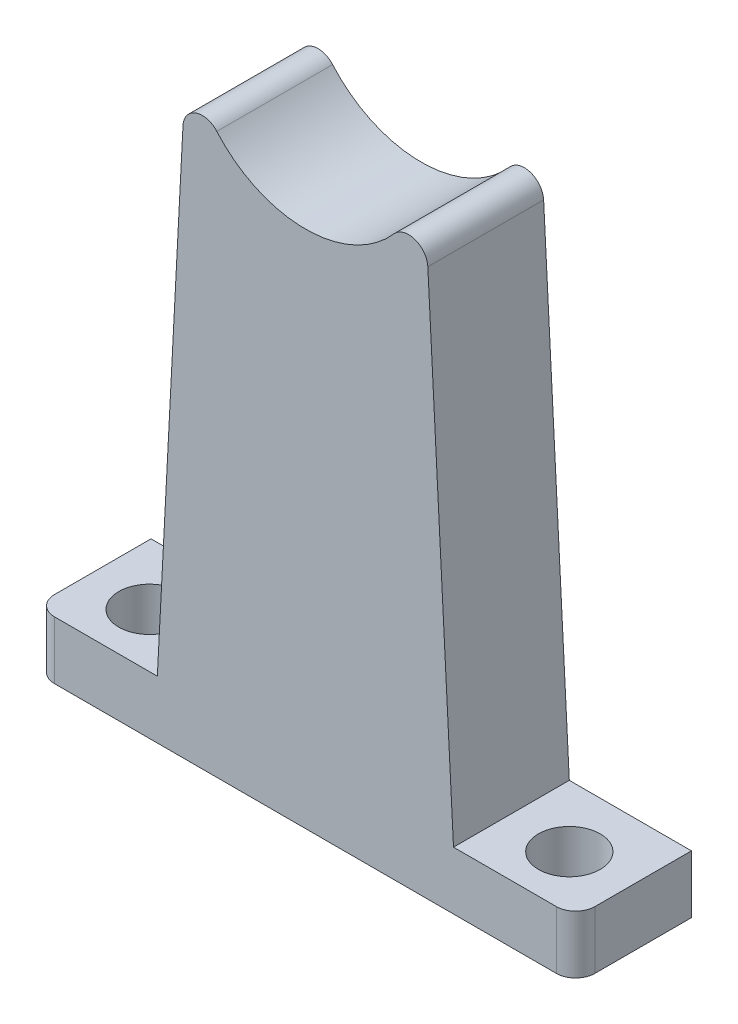
ISO-10303-21;
HEADER;
FILE_DESCRIPTION(('STEP AP214'),'2;1');
FILE_NAME('part.step','',(''),(''),'','','');
FILE_SCHEMA(('AUTOMOTIVE_DESIGN { 1 0 10303 214 1 1 1 1 }'));
ENDSEC;
DATA;
#1=APPLICATION_CONTEXT('core data for automotive mechanical design processes');
#2=APPLICATION_PROTOCOL_DEFINITION('international standard','automotive_design',2000,#1);
#3=PRODUCT_CONTEXT('',#1,'mechanical');
#4=PRODUCT('Part','Part','',(#3));
#5=PRODUCT_RELATED_PRODUCT_CATEGORY('part','',(#4));
#6=PRODUCT_DEFINITION_FORMATION('','',#4);
#7=PRODUCT_DEFINITION_CONTEXT('part definition',#1,'design');
#8=PRODUCT_DEFINITION('design','',#6,#7);
#9=PRODUCT_DEFINITION_SHAPE('','',#8);
#10=(LENGTH_UNIT() NAMED_UNIT(*) SI_UNIT(.MILLI.,.METRE.));
#11=(NAMED_UNIT(*) PLANE_ANGLE_UNIT() SI_UNIT($,.RADIAN.));
#12=(NAMED_UNIT(*) SI_UNIT($,.STERADIAN.) SOLID_ANGLE_UNIT());
#13=UNCERTAINTY_MEASURE_WITH_UNIT(LENGTH_MEASURE(1.E-05),#10,'distance_accuracy_value','');
#14=(GEOMETRIC_REPRESENTATION_CONTEXT(3) GLOBAL_UNCERTAINTY_ASSIGNED_CONTEXT((#13)) GLOBAL_UNIT_ASSIGNED_CONTEXT((#10,
#11,#12)) REPRESENTATION_CONTEXT('',''));
#15=CARTESIAN_POINT('',(0.,0.,0.));
#16=DIRECTION('',(0.,0.,1.));
#17=DIRECTION('',(1.,0.,0.));
#18=AXIS2_PLACEMENT_3D('',#15,#16,#17);
#19=CARTESIAN_POINT('',(-5.34363376004674,-37.1749949987662,6.));
#20=DIRECTION('',(0.,0.,-1.));
#21=DIRECTION('',(-1.,0.,0.));
#22=AXIS2_PLACEMENT_3D('',#19,#20,#21);
#23=CYLINDRICAL_SURFACE('',#22,1.);
#24=CARTESIAN_POINT('',(-5.34363376004674,-37.1749949987662,0.));
#25=DIRECTION('',(0.,0.,1.));
#26=DIRECTION('',(1.,0.,0.));
#27=AXIS2_PLACEMENT_3D('',#24,#25,#26);
#28=CIRCLE('',#27,1.);
#29=CARTESIAN_POINT('',(-4.59100928680072,-36.51654499894,0.));
#30=VERTEX_POINT('',#29);
#31=CARTESIAN_POINT('',(-6.34226329480131,-37.1226590425232,0.));
#32=VERTEX_POINT('',#31);
#33=EDGE_CURVE('E160',#30,#32,#28,.T.);
#34=ORIENTED_EDGE('',*,*,#33,.T.);
#35=DIRECTION('',(0.,0.,-1.));
#36=VECTOR('',#35,1.);
#37=CARTESIAN_POINT('',(-6.34226329480131,-37.1226590425232,6.));
#38=LINE('',#37,#36);
#39=CARTESIAN_POINT('',(-6.34226329480131,-37.1226590425232,6.));
#40=VERTEX_POINT('',#39);
#41=EDGE_CURVE('E137',#40,#32,#38,.T.);
#42=ORIENTED_EDGE('',*,*,#41,.F.);
#43=CARTESIAN_POINT('',(-5.34363376004674,-37.1749949987662,6.));
#44=DIRECTION('',(0.,0.,1.));
#45=DIRECTION('',(1.,0.,0.));
#46=AXIS2_PLACEMENT_3D('',#43,#44,#45);
#47=CIRCLE('',#46,1.);
#48=CARTESIAN_POINT('',(-4.59100928680072,-36.51654499894,6.));
#49=VERTEX_POINT('',#48);
#50=EDGE_CURVE('E146',#49,#40,#47,.T.);
#51=ORIENTED_EDGE('',*,*,#50,.F.);
#52=DIRECTION('',(0.,0.,-1.));
#53=VECTOR('',#52,1.);
#54=CARTESIAN_POINT('',(-4.59100928680072,-36.51654499894,6.));
#55=LINE('',#54,#53);
#56=EDGE_CURVE('E198',#49,#30,#55,.T.);
#57=ORIENTED_EDGE('',*,*,#56,.T.);
#58=EDGE_LOOP('',(#34,#42,#51,#57));
#59=FACE_BOUND('',#58,.T.);
#60=ADVANCED_FACE('F45',(#59),#23,.T.);
#61=CARTESIAN_POINT('',(-6.34226329480131,-37.1226590425232,6.));
#62=DIRECTION('',(0.998629534754574,-0.0523359562429438,0.));
#63=DIRECTION('',(0.0523359562429438,0.998629534754574,0.));
#64=AXIS2_PLACEMENT_3D('',#61,#62,#63);
#65=PLANE('',#64);
#66=DIRECTION('',(-0.0523359562429438,-0.998629534754574,0.));
#67=VECTOR('',#66,1.);
#68=CARTESIAN_POINT('',(-6.34226329480131,-37.1226590425232,0.));
#69=LINE('',#68,#67);
#70=CARTESIAN_POINT('',(-7.67223337849123,-62.5,0.));
#71=VERTEX_POINT('',#70);
#72=EDGE_CURVE('E218',#32,#71,#69,.T.);
#73=ORIENTED_EDGE('',*,*,#72,.T.);
#74=DIRECTION('',(0.,0.,-1.));
#75=VECTOR('',#74,1.);
#76=CARTESIAN_POINT('',(-7.67223337849123,-62.5,6.));
#77=LINE('',#76,#75);
#78=CARTESIAN_POINT('',(-7.67223337849123,-62.5,6.));
#79=VERTEX_POINT('',#78);
#80=EDGE_CURVE('E140',#79,#71,#77,.T.);
#81=ORIENTED_EDGE('',*,*,#80,.F.);
#82=DIRECTION('',(-0.0523359562429438,-0.998629534754574,0.));
#83=VECTOR('',#82,1.);
#84=CARTESIAN_POINT('',(-6.34226329480131,-37.1226590425232,6.));
#85=LINE('',#84,#83);
#86=EDGE_CURVE('E133',#40,#79,#85,.T.);
#87=ORIENTED_EDGE('',*,*,#86,.F.);
#88=ORIENTED_EDGE('',*,*,#41,.T.);
#89=EDGE_LOOP('',(#73,#81,#87,#88));
#90=FACE_BOUND('',#89,.T.);
#91=ADVANCED_FACE('F135',(#90),#65,.F.);
#92=CARTESIAN_POINT('',(-14.,-62.5,6.));
#93=DIRECTION('',(0.,-1.,0.));
#94=DIRECTION('',(0.,0.,-1.));
#95=AXIS2_PLACEMENT_3D('',#92,#93,#94);
#96=PLANE('',#95);
#97=CARTESIAN_POINT('',(-10.8722333784912,-62.5,3.19999999999999));
#98=DIRECTION('',(0.,-1.,0.));
#99=DIRECTION('',(0.,0.,-1.));
#100=AXIS2_PLACEMENT_3D('',#97,#98,#99);
#101=CIRCLE('',#100,1.6);
#102=CARTESIAN_POINT('',(-10.8722333784912,-62.5,1.59999999999998));
#103=VERTEX_POINT('',#102);
#104=EDGE_CURVE('E177',#103,#103,#101,.T.);
#105=ORIENTED_EDGE('',*,*,#104,.T.);
#106=EDGE_LOOP('',(#105));
#107=FACE_BOUND('',#106,.T.);
#108=DIRECTION('',(0.,0.,-1.));
#109=VECTOR('',#108,1.);
#110=CARTESIAN_POINT('',(-14.,-62.5,6.));
#111=LINE('',#110,#109);
#112=CARTESIAN_POINT('',(-14.,-62.5,5.));
#113=VERTEX_POINT('',#112);
#114=CARTESIAN_POINT('',(-14.,-62.5,0.));
#115=VERTEX_POINT('',#114);
#116=EDGE_CURVE('E170',#113,#115,#111,.T.);
#117=ORIENTED_EDGE('',*,*,#116,.F.);
#118=CARTESIAN_POINT('',(-13.,-62.5,5.));
#119=DIRECTION('',(0.,-1.,0.));
#120=DIRECTION('',(0.,0.,-1.));
#121=AXIS2_PLACEMENT_3D('',#118,#119,#120);
#122=CIRCLE('',#121,1.);
#123=CARTESIAN_POINT('',(-13.,-62.5,6.));
#124=VERTEX_POINT('',#123);
#125=EDGE_CURVE('E11',#113,#124,#122,.F.);
#126=ORIENTED_EDGE('',*,*,#125,.T.);
#127=DIRECTION('',(-1.,0.,0.));
#128=VECTOR('',#127,1.);
#129=CARTESIAN_POINT('',(-14.,-62.5,6.));
#130=LINE('',#129,#128);
#131=EDGE_CURVE('E145',#79,#124,#130,.T.);
#132=ORIENTED_EDGE('',*,*,#131,.F.);
#133=ORIENTED_EDGE('',*,*,#80,.T.);
#134=DIRECTION('',(-1.,0.,0.));
#135=VECTOR('',#134,1.);
#136=CARTESIAN_POINT('',(-14.,-62.5,0.));
#137=LINE('',#136,#135);
#138=EDGE_CURVE('E215',#71,#115,#137,.T.);
#139=ORIENTED_EDGE('',*,*,#138,.T.);
#140=EDGE_LOOP('',(#117,#126,#132,#133,#139));
#141=FACE_BOUND('',#140,.T.);
#142=ADVANCED_FACE('F304',(#107,#141),#96,.F.);
#143=CARTESIAN_POINT('',(-14.,-62.5,6.));
#144=DIRECTION('',(1.,0.,0.));
#145=DIRECTION('',(0.,0.,-1.));
#146=AXIS2_PLACEMENT_3D('',#143,#144,#145);
#147=PLANE('',#146);
#148=DIRECTION('',(0.,0.,-1.));
#149=VECTOR('',#148,1.);
#150=CARTESIAN_POINT('',(-14.,-65.5,6.));
#151=LINE('',#150,#149);
#152=CARTESIAN_POINT('',(-14.,-65.5,5.));
#153=VERTEX_POINT('',#152);
#154=CARTESIAN_POINT('',(-14.,-65.5,0.));
#155=VERTEX_POINT('',#154);
#156=EDGE_CURVE('E221',#153,#155,#151,.T.);
#157=ORIENTED_EDGE('',*,*,#156,.F.);
#158=DIRECTION('',(0.,-1.,0.));
#159=VECTOR('',#158,1.);
#160=CARTESIAN_POINT('',(-14.,-62.5,5.));
#161=LINE('',#160,#159);
#162=EDGE_CURVE('E54',#153,#113,#161,.F.);
#163=ORIENTED_EDGE('',*,*,#162,.T.);
#164=ORIENTED_EDGE('',*,*,#116,.T.);
#165=DIRECTION('',(0.,-1.,0.));
#166=VECTOR('',#165,1.);
#167=CARTESIAN_POINT('',(-14.,-62.5,0.));
#168=LINE('',#167,#166);
#169=EDGE_CURVE('E213',#115,#155,#168,.T.);
#170=ORIENTED_EDGE('',*,*,#169,.T.);
#171=EDGE_LOOP('',(#157,#163,#164,#170));
#172=FACE_BOUND('',#171,.T.);
#173=ADVANCED_FACE('F306',(#172),#147,.F.);
#174=CARTESIAN_POINT('',(-14.,-65.5,6.));
#175=DIRECTION('',(0.,1.,0.));
#176=DIRECTION('',(0.,0.,1.));
#177=AXIS2_PLACEMENT_3D('',#174,#175,#176);
#178=PLANE('',#177);
#179=CARTESIAN_POINT('',(10.8722333784912,-65.5,3.19999999999999));
#180=DIRECTION('',(0.,-1.,0.));
#181=DIRECTION('',(0.,0.,-1.));
#182=AXIS2_PLACEMENT_3D('',#179,#180,#181);
#183=CIRCLE('',#182,1.6);
#184=CARTESIAN_POINT('',(10.8722333784912,-65.5,1.59999999999999));
#185=VERTEX_POINT('',#184);
#186=EDGE_CURVE('E178',#185,#185,#183,.T.);
#187=ORIENTED_EDGE('',*,*,#186,.F.);
#188=EDGE_LOOP('',(#187));
#189=FACE_BOUND('',#188,.T.);
#190=CARTESIAN_POINT('',(-10.8722333784912,-65.5,3.19999999999999));
#191=DIRECTION('',(0.,-1.,0.));
#192=DIRECTION('',(0.,0.,-1.));
#193=AXIS2_PLACEMENT_3D('',#190,#191,#192);
#194=CIRCLE('',#193,1.6);
#195=CARTESIAN_POINT('',(-10.8722333784912,-65.5,1.59999999999998));
#196=VERTEX_POINT('',#195);
#197=EDGE_CURVE('E232',#196,#196,#194,.T.);
#198=ORIENTED_EDGE('',*,*,#197,.F.);
#199=EDGE_LOOP('',(#198));
#200=FACE_BOUND('',#199,.T.);
#201=DIRECTION('',(0.,0.,-1.));
#202=VECTOR('',#201,1.);
#203=CARTESIAN_POINT('',(14.,-65.5,6.));
#204=LINE('',#203,#202);
#205=CARTESIAN_POINT('',(14.,-65.5,5.));
#206=VERTEX_POINT('',#205);
#207=CARTESIAN_POINT('',(14.,-65.5,0.));
#208=VERTEX_POINT('',#207);
#209=EDGE_CURVE('E227',#206,#208,#204,.T.);
#210=ORIENTED_EDGE('',*,*,#209,.F.);
#211=CARTESIAN_POINT('',(13.,-65.5,5.));
#212=DIRECTION('',(0.,1.,0.));
#213=DIRECTION('',(0.,0.,1.));
#214=AXIS2_PLACEMENT_3D('',#211,#212,#213);
#215=CIRCLE('',#214,1.);
#216=CARTESIAN_POINT('',(13.,-65.5,6.));
#217=VERTEX_POINT('',#216);
#218=EDGE_CURVE('E190',#206,#217,#215,.F.);
#219=ORIENTED_EDGE('',*,*,#218,.T.);
#220=DIRECTION('',(1.,0.,0.));
#221=VECTOR('',#220,1.);
#222=CARTESIAN_POINT('',(-14.,-65.5,6.));
#223=LINE('',#222,#221);
#224=CARTESIAN_POINT('',(-13.,-65.5,6.));
#225=VERTEX_POINT('',#224);
#226=EDGE_CURVE('E245',#225,#217,#223,.T.);
#227=ORIENTED_EDGE('',*,*,#226,.F.);
#228=CARTESIAN_POINT('',(-13.,-65.5,5.));
#229=DIRECTION('',(0.,1.,0.));
#230=DIRECTION('',(0.,0.,1.));
#231=AXIS2_PLACEMENT_3D('',#228,#229,#230);
#232=CIRCLE('',#231,1.);
#233=EDGE_CURVE('E68',#225,#153,#232,.F.);
#234=ORIENTED_EDGE('',*,*,#233,.T.);
#235=ORIENTED_EDGE('',*,*,#156,.T.);
#236=DIRECTION('',(1.,0.,0.));
#237=VECTOR('',#236,1.);
#238=CARTESIAN_POINT('',(-14.,-65.5,0.));
#239=LINE('',#238,#237);
#240=EDGE_CURVE('E204',#155,#208,#239,.T.);
#241=ORIENTED_EDGE('',*,*,#240,.T.);
#242=EDGE_LOOP('',(#210,#219,#227,#234,#235,#241));
#243=FACE_BOUND('',#242,.T.);
#244=ADVANCED_FACE('F282',(#189,#200,#243),#178,.F.);
#245=CARTESIAN_POINT('',(14.,-62.5,6.));
#246=DIRECTION('',(-1.,0.,0.));
#247=DIRECTION('',(0.,0.,1.));
#248=AXIS2_PLACEMENT_3D('',#245,#246,#247);
#249=PLANE('',#248);
#250=DIRECTION('',(0.,0.,-1.));
#251=VECTOR('',#250,1.);
#252=CARTESIAN_POINT('',(14.,-62.5,6.));
#253=LINE('',#252,#251);
#254=CARTESIAN_POINT('',(14.,-62.5,5.));
#255=VERTEX_POINT('',#254);
#256=CARTESIAN_POINT('',(14.,-62.5,0.));
#257=VERTEX_POINT('',#256);
#258=EDGE_CURVE('E225',#255,#257,#253,.T.);
#259=ORIENTED_EDGE('',*,*,#258,.F.);
#260=DIRECTION('',(0.,1.,0.));
#261=VECTOR('',#260,1.);
#262=CARTESIAN_POINT('',(14.,-65.5,5.));
#263=LINE('',#262,#261);
#264=EDGE_CURVE('E185',#255,#206,#263,.F.);
#265=ORIENTED_EDGE('',*,*,#264,.T.);
#266=ORIENTED_EDGE('',*,*,#209,.T.);
#267=DIRECTION('',(0.,1.,0.));
#268=VECTOR('',#267,1.);
#269=CARTESIAN_POINT('',(14.,-62.5,0.));
#270=LINE('',#269,#268);
#271=EDGE_CURVE('E200',#208,#257,#270,.T.);
#272=ORIENTED_EDGE('',*,*,#271,.T.);
#273=EDGE_LOOP('',(#259,#265,#266,#272));
#274=FACE_BOUND('',#273,.T.);
#275=ADVANCED_FACE('F277',(#274),#249,.F.);
#276=CARTESIAN_POINT('',(7.67223337849121,-62.5,6.));
#277=DIRECTION('',(0.,-1.,0.));
#278=DIRECTION('',(0.,0.,-1.));
#279=AXIS2_PLACEMENT_3D('',#276,#277,#278);
#280=PLANE('',#279);
#281=CARTESIAN_POINT('',(10.8722333784912,-62.5,3.19999999999999));
#282=DIRECTION('',(0.,-1.,0.));
#283=DIRECTION('',(0.,0.,-1.));
#284=AXIS2_PLACEMENT_3D('',#281,#282,#283);
#285=CIRCLE('',#284,1.6);
#286=CARTESIAN_POINT('',(10.8722333784912,-62.5,1.59999999999999));
#287=VERTEX_POINT('',#286);
#288=EDGE_CURVE('E174',#287,#287,#285,.T.);
#289=ORIENTED_EDGE('',*,*,#288,.T.);
#290=EDGE_LOOP('',(#289));
#291=FACE_BOUND('',#290,.T.);
#292=DIRECTION('',(-1.,0.,0.));
#293=VECTOR('',#292,1.);
#294=CARTESIAN_POINT('',(7.67223337849121,-62.5,6.));
#295=LINE('',#294,#293);
#296=CARTESIAN_POINT('',(13.,-62.5,6.));
#297=VERTEX_POINT('',#296);
#298=CARTESIAN_POINT('',(7.67223337849121,-62.5,6.));
#299=VERTEX_POINT('',#298);
#300=EDGE_CURVE('E209',#297,#299,#295,.T.);
#301=ORIENTED_EDGE('',*,*,#300,.F.);
#302=CARTESIAN_POINT('',(13.,-62.5,5.));
#303=DIRECTION('',(0.,-1.,0.));
#304=DIRECTION('',(0.,0.,-1.));
#305=AXIS2_PLACEMENT_3D('',#302,#303,#304);
#306=CIRCLE('',#305,1.);
#307=EDGE_CURVE('E183',#297,#255,#306,.F.);
#308=ORIENTED_EDGE('',*,*,#307,.T.);
#309=ORIENTED_EDGE('',*,*,#258,.T.);
#310=DIRECTION('',(-1.,0.,0.));
#311=VECTOR('',#310,1.);
#312=CARTESIAN_POINT('',(7.67223337849121,-62.5,0.));
#313=LINE('',#312,#311);
#314=CARTESIAN_POINT('',(7.67223337849121,-62.5,0.));
#315=VERTEX_POINT('',#314);
#316=EDGE_CURVE('E203',#257,#315,#313,.T.);
#317=ORIENTED_EDGE('',*,*,#316,.T.);
#318=DIRECTION('',(0.,0.,-1.));
#319=VECTOR('',#318,1.);
#320=CARTESIAN_POINT('',(7.67223337849121,-62.5,6.));
#321=LINE('',#320,#319);
#322=EDGE_CURVE('E228',#299,#315,#321,.T.);
#323=ORIENTED_EDGE('',*,*,#322,.F.);
#324=EDGE_LOOP('',(#301,#308,#309,#317,#323));
#325=FACE_BOUND('',#324,.T.);
#326=ADVANCED_FACE('F290',(#291,#325),#280,.F.);
#327=CARTESIAN_POINT('',(6.34226329480131,-37.1226590425232,6.));
#328=DIRECTION('',(-0.998629534754574,-0.0523359562429431,0.));
#329=DIRECTION('',(0.0523359562429431,-0.998629534754574,0.));
#330=AXIS2_PLACEMENT_3D('',#327,#328,#329);
#331=PLANE('',#330);
#332=DIRECTION('',(-0.0523359562429431,0.998629534754574,0.));
#333=VECTOR('',#332,1.);
#334=CARTESIAN_POINT('',(6.34226329480131,-37.1226590425232,0.));
#335=LINE('',#334,#333);
#336=CARTESIAN_POINT('',(6.34226329480131,-37.1226590425232,0.));
#337=VERTEX_POINT('',#336);
#338=EDGE_CURVE('E234',#315,#337,#335,.T.);
#339=ORIENTED_EDGE('',*,*,#338,.T.);
#340=DIRECTION('',(0.,0.,-1.));
#341=VECTOR('',#340,1.);
#342=CARTESIAN_POINT('',(6.34226329480131,-37.1226590425232,6.));
#343=LINE('',#342,#341);
#344=CARTESIAN_POINT('',(6.34226329480131,-37.1226590425232,6.));
#345=VERTEX_POINT('',#344);
#346=EDGE_CURVE('E197',#345,#337,#343,.T.);
#347=ORIENTED_EDGE('',*,*,#346,.F.);
#348=DIRECTION('',(-0.0523359562429431,0.998629534754574,0.));
#349=VECTOR('',#348,1.);
#350=CARTESIAN_POINT('',(6.34226329480131,-37.1226590425232,6.));
#351=LINE('',#350,#349);
#352=EDGE_CURVE('E206',#299,#345,#351,.T.);
#353=ORIENTED_EDGE('',*,*,#352,.F.);
#354=ORIENTED_EDGE('',*,*,#322,.T.);
#355=EDGE_LOOP('',(#339,#347,#353,#354));
#356=FACE_BOUND('',#355,.T.);
#357=ADVANCED_FACE('F293',(#356),#331,.F.);
#358=CARTESIAN_POINT('',(5.34363376004673,-37.1749949987662,6.));
#359=DIRECTION('',(0.,0.,-1.));
#360=DIRECTION('',(-1.,0.,0.));
#361=AXIS2_PLACEMENT_3D('',#358,#359,#360);
#362=CYLINDRICAL_SURFACE('',#361,1.);
#363=CARTESIAN_POINT('',(5.34363376004673,-37.1749949987662,0.));
#364=DIRECTION('',(0.,0.,1.));
#365=DIRECTION('',(-1.,0.,0.));
#366=AXIS2_PLACEMENT_3D('',#363,#364,#365);
#367=CIRCLE('',#366,1.);
#368=CARTESIAN_POINT('',(4.59100928680071,-36.51654499894,0.));
#369=VERTEX_POINT('',#368);
#370=EDGE_CURVE('E236',#337,#369,#367,.T.);
#371=ORIENTED_EDGE('',*,*,#370,.T.);
#372=DIRECTION('',(0.,0.,-1.));
#373=VECTOR('',#372,1.);
#374=CARTESIAN_POINT('',(4.59100928680071,-36.51654499894,6.));
#375=LINE('',#374,#373);
#376=CARTESIAN_POINT('',(4.59100928680071,-36.51654499894,6.));
#377=VERTEX_POINT('',#376);
#378=EDGE_CURVE('E194',#377,#369,#375,.T.);
#379=ORIENTED_EDGE('',*,*,#378,.F.);
#380=CARTESIAN_POINT('',(5.34363376004673,-37.1749949987662,6.));
#381=DIRECTION('',(0.,0.,1.));
#382=DIRECTION('',(-1.,0.,0.));
#383=AXIS2_PLACEMENT_3D('',#380,#381,#382);
#384=CIRCLE('',#383,1.);
#385=EDGE_CURVE('E208',#345,#377,#384,.T.);
#386=ORIENTED_EDGE('',*,*,#385,.F.);
#387=ORIENTED_EDGE('',*,*,#346,.T.);
#388=EDGE_LOOP('',(#371,#379,#386,#387));
#389=FACE_BOUND('',#388,.T.);
#390=ADVANCED_FACE('F346',(#389),#362,.T.);
#391=CARTESIAN_POINT('',(0.,-32.5,6.));
#392=DIRECTION('',(0.,0.,-1.));
#393=DIRECTION('',(-1.,0.,0.));
#394=AXIS2_PLACEMENT_3D('',#391,#392,#393);
#395=CYLINDRICAL_SURFACE('',#394,6.1);
#396=CARTESIAN_POINT('',(0.,-32.5,0.));
#397=DIRECTION('',(0.,0.,-1.));
#398=DIRECTION('',(1.,0.,0.));
#399=AXIS2_PLACEMENT_3D('',#396,#397,#398);
#400=CIRCLE('',#399,6.1);
#401=EDGE_CURVE('E157',#369,#30,#400,.T.);
#402=ORIENTED_EDGE('',*,*,#401,.T.);
#403=ORIENTED_EDGE('',*,*,#56,.F.);
#404=CARTESIAN_POINT('',(0.,-32.5,6.));
#405=DIRECTION('',(0.,0.,-1.));
#406=DIRECTION('',(1.,0.,0.));
#407=AXIS2_PLACEMENT_3D('',#404,#405,#406);
#408=CIRCLE('',#407,6.1);
#409=EDGE_CURVE('E152',#377,#49,#408,.T.);
#410=ORIENTED_EDGE('',*,*,#409,.F.);
#411=ORIENTED_EDGE('',*,*,#378,.T.);
#412=EDGE_LOOP('',(#402,#403,#410,#411));
#413=FACE_BOUND('',#412,.T.);
#414=ADVANCED_FACE('F341',(#413),#395,.F.);
#415=CARTESIAN_POINT('',(-5.34363376004674,-37.1749949987662,6.));
#416=DIRECTION('',(0.,0.,1.));
#417=DIRECTION('',(1.,0.,0.));
#418=AXIS2_PLACEMENT_3D('',#415,#416,#417);
#419=PLANE('',#418);
#420=ORIENTED_EDGE('',*,*,#226,.T.);
#421=DIRECTION('',(0.,1.,0.));
#422=VECTOR('',#421,1.);
#423=CARTESIAN_POINT('',(13.,-62.5,6.));
#424=LINE('',#423,#422);
#425=EDGE_CURVE('E168',#217,#297,#424,.T.);
#426=ORIENTED_EDGE('',*,*,#425,.T.);
#427=ORIENTED_EDGE('',*,*,#300,.T.);
#428=ORIENTED_EDGE('',*,*,#352,.T.);
#429=ORIENTED_EDGE('',*,*,#385,.T.);
#430=ORIENTED_EDGE('',*,*,#409,.T.);
#431=ORIENTED_EDGE('',*,*,#50,.T.);
#432=ORIENTED_EDGE('',*,*,#86,.T.);
#433=ORIENTED_EDGE('',*,*,#131,.T.);
#434=DIRECTION('',(0.,-1.,0.));
#435=VECTOR('',#434,1.);
#436=CARTESIAN_POINT('',(-13.,-65.5,6.));
#437=LINE('',#436,#435);
#438=EDGE_CURVE('E162',#124,#225,#437,.T.);
#439=ORIENTED_EDGE('',*,*,#438,.T.);
#440=EDGE_LOOP('',(#420,#426,#427,#428,#429,#430,#431,#432,#433,#439));
#441=FACE_BOUND('',#440,.T.);
#442=ADVANCED_FACE('F150',(#441),#419,.T.);
#443=CARTESIAN_POINT('',(-5.34363376004674,-37.1749949987662,0.));
#444=DIRECTION('',(0.,0.,1.));
#445=DIRECTION('',(1.,0.,0.));
#446=AXIS2_PLACEMENT_3D('',#443,#444,#445);
#447=PLANE('',#446);
#448=ORIENTED_EDGE('',*,*,#33,.F.);
#449=ORIENTED_EDGE('',*,*,#401,.F.);
#450=ORIENTED_EDGE('',*,*,#370,.F.);
#451=ORIENTED_EDGE('',*,*,#338,.F.);
#452=ORIENTED_EDGE('',*,*,#316,.F.);
#453=ORIENTED_EDGE('',*,*,#271,.F.);
#454=ORIENTED_EDGE('',*,*,#240,.F.);
#455=ORIENTED_EDGE('',*,*,#169,.F.);
#456=ORIENTED_EDGE('',*,*,#138,.F.);
#457=ORIENTED_EDGE('',*,*,#72,.F.);
#458=EDGE_LOOP('',(#448,#449,#450,#451,#452,#453,#454,#455,#456,#457));
#459=FACE_BOUND('',#458,.T.);
#460=ADVANCED_FACE('F284',(#459),#447,.F.);
#461=CARTESIAN_POINT('',(10.8722333784912,-55.5,3.19999999999999));
#462=DIRECTION('',(0.,-1.,0.));
#463=DIRECTION('',(0.,0.,-1.));
#464=AXIS2_PLACEMENT_3D('',#461,#462,#463);
#465=CYLINDRICAL_SURFACE('',#464,1.6);
#466=ORIENTED_EDGE('',*,*,#186,.T.);
#467=EDGE_LOOP('',(#466));
#468=FACE_BOUND('',#467,.T.);
#469=ORIENTED_EDGE('',*,*,#288,.F.);
#470=EDGE_LOOP('',(#469));
#471=FACE_BOUND('',#470,.T.);
#472=ADVANCED_FACE('F329',(#468,#471),#465,.F.);
#473=CARTESIAN_POINT('',(-10.8722333784912,-55.5,3.19999999999999));
#474=DIRECTION('',(0.,-1.,0.));
#475=DIRECTION('',(0.,0.,-1.));
#476=AXIS2_PLACEMENT_3D('',#473,#474,#475);
#477=CYLINDRICAL_SURFACE('',#476,1.6);
#478=ORIENTED_EDGE('',*,*,#197,.T.);
#479=EDGE_LOOP('',(#478));
#480=FACE_BOUND('',#479,.T.);
#481=ORIENTED_EDGE('',*,*,#104,.F.);
#482=EDGE_LOOP('',(#481));
#483=FACE_BOUND('',#482,.T.);
#484=ADVANCED_FACE('F324',(#480,#483),#477,.F.);
#485=CARTESIAN_POINT('',(13.,-37.1749949987662,5.));
#486=DIRECTION('',(0.,-1.,0.));
#487=DIRECTION('',(0.,0.,-1.));
#488=AXIS2_PLACEMENT_3D('',#485,#486,#487);
#489=CYLINDRICAL_SURFACE('',#488,1.);
#490=ORIENTED_EDGE('',*,*,#218,.F.);
#491=ORIENTED_EDGE('',*,*,#264,.F.);
#492=ORIENTED_EDGE('',*,*,#307,.F.);
#493=ORIENTED_EDGE('',*,*,#425,.F.);
#494=EDGE_LOOP('',(#490,#491,#492,#493));
#495=FACE_BOUND('',#494,.T.);
#496=ADVANCED_FACE('F299',(#495),#489,.T.);
#497=CARTESIAN_POINT('',(-13.,-37.1749949987662,5.));
#498=DIRECTION('',(0.,1.,0.));
#499=DIRECTION('',(0.,0.,1.));
#500=AXIS2_PLACEMENT_3D('',#497,#498,#499);
#501=CYLINDRICAL_SURFACE('',#500,1.);
#502=ORIENTED_EDGE('',*,*,#125,.F.);
#503=ORIENTED_EDGE('',*,*,#162,.F.);
#504=ORIENTED_EDGE('',*,*,#233,.F.);
#505=ORIENTED_EDGE('',*,*,#438,.F.);
#506=EDGE_LOOP('',(#502,#503,#504,#505));
#507=FACE_BOUND('',#506,.T.);
#508=ADVANCED_FACE('F47',(#507),#501,.T.);
#509=CLOSED_SHELL('',(#60,#91,#142,#173,#244,#275,#326,#357,#390,#414,#442,#460,#472,#484,#496,#508));
#510=MANIFOLD_SOLID_BREP('B2',#509);
#511=ADVANCED_BREP_SHAPE_REPRESENTATION('',(#18,#510),#14);
#512=SHAPE_DEFINITION_REPRESENTATION(#9,#511);
ENDSEC;
END-ISO-10303-21;
